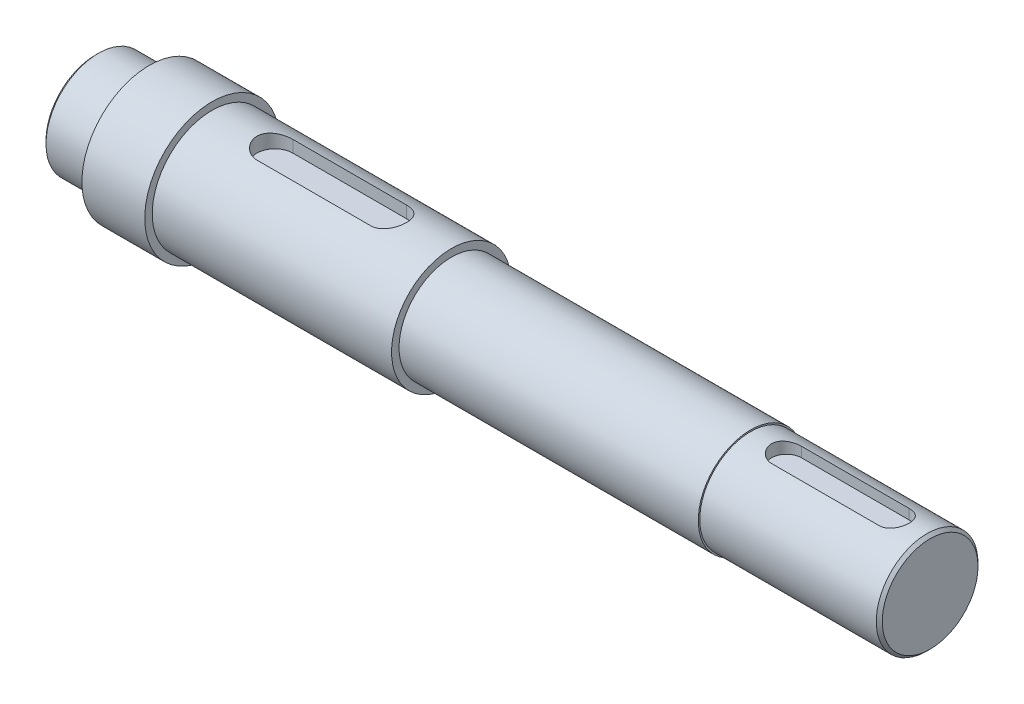
ISO-10303-21;
HEADER;
FILE_DESCRIPTION(('STEP AP214'),'2;1');
FILE_NAME('part.step','',(''),(''),'','','');
FILE_SCHEMA(('AUTOMOTIVE_DESIGN { 1 0 10303 214 1 1 1 1 }'));
ENDSEC;
DATA;
#1=APPLICATION_CONTEXT('core data for automotive mechanical design processes');
#2=APPLICATION_PROTOCOL_DEFINITION('international standard','automotive_design',2000,#1);
#3=PRODUCT_CONTEXT('',#1,'mechanical');
#4=PRODUCT('Part','Part','',(#3));
#5=PRODUCT_RELATED_PRODUCT_CATEGORY('part','',(#4));
#6=PRODUCT_DEFINITION_FORMATION('','',#4);
#7=PRODUCT_DEFINITION_CONTEXT('part definition',#1,'design');
#8=PRODUCT_DEFINITION('design','',#6,#7);
#9=PRODUCT_DEFINITION_SHAPE('','',#8);
#10=(LENGTH_UNIT() NAMED_UNIT(*) SI_UNIT(.MILLI.,.METRE.));
#11=(NAMED_UNIT(*) PLANE_ANGLE_UNIT() SI_UNIT($,.RADIAN.));
#12=(NAMED_UNIT(*) SI_UNIT($,.STERADIAN.) SOLID_ANGLE_UNIT());
#13=UNCERTAINTY_MEASURE_WITH_UNIT(LENGTH_MEASURE(1.E-05),#10,'distance_accuracy_value','');
#14=(GEOMETRIC_REPRESENTATION_CONTEXT(3) GLOBAL_UNCERTAINTY_ASSIGNED_CONTEXT((#13)) GLOBAL_UNIT_ASSIGNED_CONTEXT((#10,
#11,#12)) REPRESENTATION_CONTEXT('',''));
#15=CARTESIAN_POINT('',(0.,0.,0.));
#16=DIRECTION('',(0.,0.,1.));
#17=DIRECTION('',(1.,0.,0.));
#18=AXIS2_PLACEMENT_3D('',#15,#16,#17);
#19=CARTESIAN_POINT('',(-40.,0.,0.));
#20=DIRECTION('',(1.,0.,0.));
#21=DIRECTION('',(0.,0.,-1.));
#22=AXIS2_PLACEMENT_3D('',#19,#20,#21);
#23=CYLINDRICAL_SURFACE('',#22,20.);
#24=CARTESIAN_POINT('',(19.,19.0787840283389,5.99999999999999));
#25=CARTESIAN_POINT('',(19.1646679949108,19.0787603919218,6.00002230630953));
#26=CARTESIAN_POINT('',(19.3293273869304,19.0809150948054,5.9932221282886));
#27=CARTESIAN_POINT('',(19.6573894283846,19.089408588524,5.96614198358438));
#28=CARTESIAN_POINT('',(19.8207923520137,19.0957464386677,5.94586504749982));
#29=CARTESIAN_POINT('',(20.1447667936842,19.1124126760415,5.89206455668659));
#30=CARTESIAN_POINT('',(20.3053444279638,19.1227309292375,5.85857463708937));
#31=CARTESIAN_POINT('',(20.6229623086685,19.1470349488515,5.77865096251377));
#32=CARTESIAN_POINT('',(20.7800024624693,19.1610208111801,5.73221686903431));
#33=CARTESIAN_POINT('',(21.0893825607235,19.1922338155173,5.62682620459483));
#34=CARTESIAN_POINT('',(21.2417252187759,19.2094590438083,5.56787702452552));
#35=CARTESIAN_POINT('',(21.5408741429016,19.2466621419291,5.43788252899624));
#36=CARTESIAN_POINT('',(21.687678324328,19.2666410353108,5.36683271334056));
#37=CARTESIAN_POINT('',(21.9747849452531,19.3087849542851,5.21317247195194));
#38=CARTESIAN_POINT('',(22.1150870185297,19.3309501027959,5.13056139609832));
#39=CARTESIAN_POINT('',(22.3883877986748,19.3768680311909,4.95431913401973));
#40=CARTESIAN_POINT('',(22.5213837168722,19.4006214097184,4.8606837822377));
#41=CARTESIAN_POINT('',(22.7828635732296,19.4497584548899,4.66024014290222));
#42=CARTESIAN_POINT('',(22.9111151521982,19.4751691904069,4.55313526362689));
#43=CARTESIAN_POINT('',(23.1582539370087,19.5263015189751,4.32860344600265));
#44=CARTESIAN_POINT('',(23.2771378666711,19.5520232171847,4.21117292654717));
#45=CARTESIAN_POINT('',(23.5047413951219,19.6030710031715,3.96676059198591));
#46=CARTESIAN_POINT('',(23.6134609320288,19.6283970885393,3.83977871873937));
#47=CARTESIAN_POINT('',(23.8200192544725,19.6779706962222,3.57705696576209));
#48=CARTESIAN_POINT('',(23.917858125839,19.7022182270443,3.44131715512968));
#49=CARTESIAN_POINT('',(24.1039097682599,19.7494715734221,3.15899953964076));
#50=CARTESIAN_POINT('',(24.1918780463025,19.7724407517412,3.01225429870653));
#51=CARTESIAN_POINT('',(24.355063794055,19.8159158974823,2.71155717798051));
#52=CARTESIAN_POINT('',(24.430285978567,19.8364227748921,2.55760798995095));
#53=CARTESIAN_POINT('',(24.5674164393714,19.8744001644265,2.2434899603248));
#54=CARTESIAN_POINT('',(24.6293222547682,19.8918701152059,2.08331997555618));
#55=CARTESIAN_POINT('',(24.7392375024558,19.923254535561,1.75801430484772));
#56=CARTESIAN_POINT('',(24.7872529399682,19.9371705413066,1.59288079897388));
#57=CARTESIAN_POINT('',(24.8678255467277,19.960709769643,1.26354510595574));
#58=CARTESIAN_POINT('',(24.9007806269582,19.9704430293701,1.09944808925078));
#59=CARTESIAN_POINT('',(24.9528719972864,19.9858966495547,0.768952154148941));
#60=CARTESIAN_POINT('',(24.9720138041346,19.9916186120195,0.602554181799287));
#61=CARTESIAN_POINT('',(24.9963199648569,19.9988929276978,0.268644299740222));
#62=CARTESIAN_POINT('',(25.0014838943061,20.0004451543012,0.101132356360969));
#63=CARTESIAN_POINT('',(24.9977835949215,19.9993350985709,-0.233720900410867));
#64=CARTESIAN_POINT('',(24.9889196235372,19.9966728935831,-0.40106221687851));
#65=CARTESIAN_POINT('',(24.9577577883976,19.9873626800314,-0.728949940400316));
#66=CARTESIAN_POINT('',(24.9358999900172,19.9808452710305,-0.889542117296662));
#67=CARTESIAN_POINT('',(24.8793045182417,19.9641050678088,-1.20830021014907));
#68=CARTESIAN_POINT('',(24.8445624577749,19.9538810115069,-1.36646528055415));
#69=CARTESIAN_POINT('',(24.7625076983902,19.9300014175933,-1.67917461818939));
#70=CARTESIAN_POINT('',(24.7151992242771,19.916347033335,-1.83372008335732));
#71=CARTESIAN_POINT('',(24.6083697289368,19.885954581515,-2.13828018933735));
#72=CARTESIAN_POINT('',(24.5488441160033,19.8692153547843,-2.28829310223871));
#73=CARTESIAN_POINT('',(24.4173094204607,19.8328818557961,-2.58443507880942));
#74=CARTESIAN_POINT('',(24.3451671028017,19.8132575095082,-2.73050124822121));
#75=CARTESIAN_POINT('',(24.1893768526706,19.7717979578185,-3.01609632375421));
#76=CARTESIAN_POINT('',(24.1057249716159,19.7499619943591,-3.15562296424242));
#77=CARTESIAN_POINT('',(23.9275130175587,19.704643118031,-3.42724384686892));
#78=CARTESIAN_POINT('',(23.8329528185717,19.681160186142,-3.55933800314028));
#79=CARTESIAN_POINT('',(23.6335413215712,19.6331439703208,-3.81531376455357));
#80=CARTESIAN_POINT('',(23.5286897234991,19.6086106557752,-3.93919513006485));
#81=CARTESIAN_POINT('',(23.3051027565368,19.5581593507452,-4.18263653591652));
#82=CARTESIAN_POINT('',(23.1859873205257,19.5322244988475,-4.30184428600934));
#83=CARTESIAN_POINT('',(22.9381664964976,19.4806179410542,-4.52981041510268));
#84=CARTESIAN_POINT('',(22.8094642039191,19.454946153239,-4.63857214120816));
#85=CARTESIAN_POINT('',(22.5431596037615,19.4045581786367,-4.84504126060966));
#86=CARTESIAN_POINT('',(22.4055514280994,19.3798426394128,-4.94274124635233));
#87=CARTESIAN_POINT('',(22.1224409076672,19.3321023379674,-5.12628631686325));
#88=CARTESIAN_POINT('',(21.9769416624216,19.3090769201297,-5.21213600998878));
#89=CARTESIAN_POINT('',(21.6773648649068,19.2651525602885,-5.37223080367567));
#90=CARTESIAN_POINT('',(21.523212921341,19.2442786555291,-5.44634371437402));
#91=CARTESIAN_POINT('',(21.2088781586389,19.2055937237889,-5.58122691640504));
#92=CARTESIAN_POINT('',(21.0486978375224,19.1877814448102,-5.64200266456204));
#93=CARTESIAN_POINT('',(20.7235678816501,19.1557967477957,-5.74966145349632));
#94=CARTESIAN_POINT('',(20.5586234734372,19.1416204978023,-5.79655912825488));
#95=CARTESIAN_POINT('',(20.225106819549,19.1173543231182,-5.87609462586439));
#96=CARTESIAN_POINT('',(20.0565362849515,19.1072625137754,-5.90873902604378));
#97=CARTESIAN_POINT('',(19.7400629297635,19.0925703406668,-5.95603131732402));
#98=CARTESIAN_POINT('',(19.59245829064,19.0874107715083,-5.97251971262426));
#99=CARTESIAN_POINT('',(19.2965728875247,19.0805126306352,-5.99450261914156));
#100=CARTESIAN_POINT('',(19.1482934404253,19.0787690288453,-6.00001329545509));
#101=CARTESIAN_POINT('',(19.,19.0787840283389,-6.00000000000001));
#102=B_SPLINE_CURVE_WITH_KNOTS('',3,(#24,#25,#26,#27,#28,#29,#30,#31,#32,#33,#34,#35,#36,#37,
#38,#39,#40,#41,#42,#43,#44,#45,#46,#47,#48,#49,#50,#51,#52,#53,#54,#55,#56,#57,#58,#59,#60,#61,
#62,#63,#64,#65,#66,#67,#68,#69,#70,#71,#72,#73,#74,#75,#76,#77,#78,#79,#80,#81,#82,#83,#84,#85,
#86,#87,#88,#89,#90,#91,#92,#93,#94,#95,#96,#97,#98,#99,#100,#101),.UNSPECIFIED.,.F.,.F.,(4,2,2,
2,2,2,2,2,2,2,2,2,2,2,2,2,2,2,2,2,2,2,2,2,2,2,2,2,2,2,2,2,2,2,2,2,2,2,4),(0.,0.493836284878931,
0.987561555412166,1.48003801924602,1.97252736296405,2.4647266679518,2.95710942192587,
3.44951987503683,3.94211698773001,4.44857898474592,4.95521732942467,5.46185875834847,
5.96849619046396,6.48574341264195,7.00279888450885,7.5199498274806,8.03687685551445,
8.53921958328379,9.04136157401789,9.5435188116382,10.0456668334346,10.531706521874,
11.0179118582603,11.5039539397551,11.9901790315928,12.4818885441265,12.9737671698834,
13.4656514771114,13.9575501300996,14.4684682486943,14.9792221093922,15.4903160010787,
16.001210574562,16.5175029344931,17.0335836608614,17.549118241575,18.0644146711719,
18.509813123396,18.9545552237083),.UNSPECIFIED.);
#103=CARTESIAN_POINT('',(19.,19.0787840283389,5.99999999999999));
#104=VERTEX_POINT('',#103);
#105=CARTESIAN_POINT('',(19.,19.0787840283389,-6.00000000000001));
#106=VERTEX_POINT('',#105);
#107=EDGE_CURVE('E181',#104,#106,#102,.T.);
#108=ORIENTED_EDGE('',*,*,#107,.F.);
#109=DIRECTION('',(1.,0.,0.));
#110=VECTOR('',#109,1.);
#111=CARTESIAN_POINT('',(-40.,19.0787840283389,6.));
#112=LINE('',#111,#110);
#113=CARTESIAN_POINT('',(-19.,19.0787840283389,6.));
#114=VERTEX_POINT('',#113);
#115=EDGE_CURVE('E149',#114,#104,#112,.T.);
#116=ORIENTED_EDGE('',*,*,#115,.F.);
#117=CARTESIAN_POINT('',(-19.,19.0787840283389,-6.));
#118=CARTESIAN_POINT('',(-19.1646679949108,19.0787603919218,-6.00002230630954));
#119=CARTESIAN_POINT('',(-19.3293273869304,19.0809150948054,-5.99322212828861));
#120=CARTESIAN_POINT('',(-19.6573894283846,19.089408588524,-5.96614198358439));
#121=CARTESIAN_POINT('',(-19.8207923520137,19.0957464386677,-5.94586504749983));
#122=CARTESIAN_POINT('',(-20.1447667936842,19.1124126760415,-5.89206455668659));
#123=CARTESIAN_POINT('',(-20.3053444279638,19.1227309292375,-5.85857463708937));
#124=CARTESIAN_POINT('',(-20.6229623086685,19.1470349488515,-5.77865096251378));
#125=CARTESIAN_POINT('',(-20.7800024624693,19.1610208111801,-5.73221686903431));
#126=CARTESIAN_POINT('',(-21.0893825607235,19.1922338155173,-5.62682620459484));
#127=CARTESIAN_POINT('',(-21.2417252187759,19.2094590438083,-5.56787702452553));
#128=CARTESIAN_POINT('',(-21.5408741429016,19.2466621419291,-5.43788252899625));
#129=CARTESIAN_POINT('',(-21.687678324328,19.2666410353108,-5.36683271334057));
#130=CARTESIAN_POINT('',(-21.9747849452531,19.3087849542851,-5.21317247195195));
#131=CARTESIAN_POINT('',(-22.1150870185297,19.3309501027959,-5.13056139609833));
#132=CARTESIAN_POINT('',(-22.3883877986748,19.3768680311909,-4.95431913401973));
#133=CARTESIAN_POINT('',(-22.5213837168722,19.4006214097184,-4.86068378223771));
#134=CARTESIAN_POINT('',(-22.7828635732296,19.4497584548899,-4.66024014290223));
#135=CARTESIAN_POINT('',(-22.9111151521982,19.4751691904069,-4.55313526362689));
#136=CARTESIAN_POINT('',(-23.1582539370087,19.5263015189751,-4.32860344600266));
#137=CARTESIAN_POINT('',(-23.2771378666711,19.5520232171847,-4.21117292654718));
#138=CARTESIAN_POINT('',(-23.5047413951219,19.6030710031715,-3.96676059198591));
#139=CARTESIAN_POINT('',(-23.6134609320288,19.6283970885393,-3.83977871873938));
#140=CARTESIAN_POINT('',(-23.8200192544725,19.6779706962222,-3.5770569657621));
#141=CARTESIAN_POINT('',(-23.917858125839,19.7022182270443,-3.44131715512968));
#142=CARTESIAN_POINT('',(-24.1039097682599,19.7494715734221,-3.15899953964076));
#143=CARTESIAN_POINT('',(-24.1918780463025,19.7724407517412,-3.01225429870653));
#144=CARTESIAN_POINT('',(-24.355063794055,19.8159158974823,-2.71155717798052));
#145=CARTESIAN_POINT('',(-24.430285978567,19.8364227748921,-2.55760798995096));
#146=CARTESIAN_POINT('',(-24.5674164393714,19.8744001644265,-2.24348996032481));
#147=CARTESIAN_POINT('',(-24.6293222547682,19.8918701152059,-2.08331997555618));
#148=CARTESIAN_POINT('',(-24.7392375024558,19.923254535561,-1.75801430484772));
#149=CARTESIAN_POINT('',(-24.7872529399682,19.9371705413066,-1.59288079897389));
#150=CARTESIAN_POINT('',(-24.8678255467277,19.960709769643,-1.26354510595574));
#151=CARTESIAN_POINT('',(-24.9007806269582,19.9704430293701,-1.09944808925078));
#152=CARTESIAN_POINT('',(-24.9528719972864,19.9858966495547,-0.768952154148946));
#153=CARTESIAN_POINT('',(-24.9720138041346,19.9916186120195,-0.602554181799292));
#154=CARTESIAN_POINT('',(-24.9963199648569,19.9988929276978,-0.268644299740228));
#155=CARTESIAN_POINT('',(-25.0014838943061,20.0004451543012,-0.101132356360973));
#156=CARTESIAN_POINT('',(-24.9977835949215,19.9993350985709,0.233720900410862));
#157=CARTESIAN_POINT('',(-24.9889196235372,19.9966728935831,0.401062216878504));
#158=CARTESIAN_POINT('',(-24.9577577883976,19.9873626800314,0.72894994040031));
#159=CARTESIAN_POINT('',(-24.9358999900172,19.9808452710305,0.889542117296655));
#160=CARTESIAN_POINT('',(-24.8793045182417,19.9641050678088,1.20830021014906));
#161=CARTESIAN_POINT('',(-24.8445624577749,19.9538810115069,1.36646528055415));
#162=CARTESIAN_POINT('',(-24.7625076983902,19.9300014175933,1.67917461818938));
#163=CARTESIAN_POINT('',(-24.7151992242771,19.916347033335,1.83372008335732));
#164=CARTESIAN_POINT('',(-24.6083697289368,19.885954581515,2.13828018933734));
#165=CARTESIAN_POINT('',(-24.5488441160033,19.8692153547843,2.2882931022387));
#166=CARTESIAN_POINT('',(-24.4173094204607,19.8328818557961,2.58443507880942));
#167=CARTESIAN_POINT('',(-24.3451671028017,19.8132575095082,2.7305012482212));
#168=CARTESIAN_POINT('',(-24.1893768526706,19.7717979578185,3.0160963237542));
#169=CARTESIAN_POINT('',(-24.1057249716159,19.7499619943591,3.15562296424241));
#170=CARTESIAN_POINT('',(-23.9275130175587,19.704643118031,3.42724384686891));
#171=CARTESIAN_POINT('',(-23.8329528185717,19.681160186142,3.55933800314027));
#172=CARTESIAN_POINT('',(-23.6335413215712,19.6331439703208,3.81531376455356));
#173=CARTESIAN_POINT('',(-23.5286897234991,19.6086106557752,3.93919513006484));
#174=CARTESIAN_POINT('',(-23.3051027565368,19.5581593507452,4.18263653591652));
#175=CARTESIAN_POINT('',(-23.1859873205257,19.5322244988475,4.30184428600934));
#176=CARTESIAN_POINT('',(-22.9381664964976,19.4806179410542,4.52981041510267));
#177=CARTESIAN_POINT('',(-22.8094642039191,19.454946153239,4.63857214120816));
#178=CARTESIAN_POINT('',(-22.5431596037615,19.4045581786367,4.84504126060965));
#179=CARTESIAN_POINT('',(-22.4055514280994,19.3798426394128,4.94274124635232));
#180=CARTESIAN_POINT('',(-22.1224409076672,19.3321023379674,5.12628631686324));
#181=CARTESIAN_POINT('',(-21.9769416624216,19.3090769201297,5.21213600998877));
#182=CARTESIAN_POINT('',(-21.6773648649068,19.2651525602885,5.37223080367566));
#183=CARTESIAN_POINT('',(-21.523212921341,19.2442786555291,5.44634371437402));
#184=CARTESIAN_POINT('',(-21.2088781586389,19.2055937237889,5.58122691640503));
#185=CARTESIAN_POINT('',(-21.0486978375224,19.1877814448102,5.64200266456203));
#186=CARTESIAN_POINT('',(-20.7235678816501,19.1557967477957,5.74966145349631));
#187=CARTESIAN_POINT('',(-20.5586234734371,19.1416204978023,5.79655912825487));
#188=CARTESIAN_POINT('',(-20.225106819549,19.1173543231182,5.87609462586438));
#189=CARTESIAN_POINT('',(-20.0565362849515,19.1072625137754,5.90873902604377));
#190=CARTESIAN_POINT('',(-19.7400629297635,19.0925703406668,5.95603131732401));
#191=CARTESIAN_POINT('',(-19.59245829064,19.0874107715083,5.97251971262425));
#192=CARTESIAN_POINT('',(-19.2965728875247,19.0805126306352,5.99450261914156));
#193=CARTESIAN_POINT('',(-19.1482934404253,19.0787690288453,6.00001329545509));
#194=CARTESIAN_POINT('',(-19.,19.0787840283389,6.));
#195=B_SPLINE_CURVE_WITH_KNOTS('',3,(#117,#118,#119,#120,#121,#122,#123,#124,#125,#126,#127,
#128,#129,#130,#131,#132,#133,#134,#135,#136,#137,#138,#139,#140,#141,#142,#143,#144,#145,#146,
#147,#148,#149,#150,#151,#152,#153,#154,#155,#156,#157,#158,#159,#160,#161,#162,#163,#164,#165,
#166,#167,#168,#169,#170,#171,#172,#173,#174,#175,#176,#177,#178,#179,#180,#181,#182,#183,#184,
#185,#186,#187,#188,#189,#190,#191,#192,#193,#194),.UNSPECIFIED.,.F.,.F.,(4,2,2,2,2,2,2,2,2,2,2,
2,2,2,2,2,2,2,2,2,2,2,2,2,2,2,2,2,2,2,2,2,2,2,2,2,2,2,4),(0.,0.493836284878931,
0.987561555412166,1.48003801924602,1.97252736296405,2.4647266679518,2.95710942192587,
3.44951987503683,3.94211698773001,4.44857898474593,4.95521732942467,5.46185875834847,
5.96849619046396,6.48574341264195,7.00279888450885,7.5199498274806,8.03687685551445,
8.53921958328379,9.04136157401789,9.54351881163821,10.0456668334346,10.531706521874,
11.0179118582603,11.5039539397551,11.9901790315928,12.4818885441265,12.9737671698834,
13.4656514771114,13.9575501300996,14.4684682486943,14.9792221093922,15.4903160010787,
16.001210574562,16.517502934493,17.0335836608614,17.5491182415751,18.0644146711719,
18.509813123396,18.9545552237083),.UNSPECIFIED.);
#196=CARTESIAN_POINT('',(-19.,19.0787840283389,-6.));
#197=VERTEX_POINT('',#196);
#198=EDGE_CURVE('E212',#197,#114,#195,.T.);
#199=ORIENTED_EDGE('',*,*,#198,.F.);
#200=DIRECTION('',(1.,0.,0.));
#201=VECTOR('',#200,1.);
#202=CARTESIAN_POINT('',(-40.,19.0787840283389,-6.));
#203=LINE('',#202,#201);
#204=EDGE_CURVE('E191',#106,#197,#203,.F.);
#205=ORIENTED_EDGE('',*,*,#204,.F.);
#206=EDGE_LOOP('',(#108,#116,#199,#205));
#207=FACE_BOUND('',#206,.T.);
#208=CARTESIAN_POINT('',(-40.,0.,0.));
#209=DIRECTION('',(1.,0.,0.));
#210=DIRECTION('',(0.,0.,-1.));
#211=AXIS2_PLACEMENT_3D('',#208,#209,#210);
#212=CIRCLE('',#211,20.);
#213=CARTESIAN_POINT('',(-40.,0.,-20.));
#214=VERTEX_POINT('',#213);
#215=EDGE_CURVE('E153',#214,#214,#212,.T.);
#216=ORIENTED_EDGE('',*,*,#215,.T.);
#217=EDGE_LOOP('',(#216));
#218=FACE_BOUND('',#217,.T.);
#219=CARTESIAN_POINT('',(40.,0.,0.));
#220=DIRECTION('',(1.,0.,0.));
#221=DIRECTION('',(0.,0.,-1.));
#222=AXIS2_PLACEMENT_3D('',#219,#220,#221);
#223=CIRCLE('',#222,20.);
#224=CARTESIAN_POINT('',(40.,0.,-20.));
#225=VERTEX_POINT('',#224);
#226=EDGE_CURVE('E171',#225,#225,#223,.T.);
#227=ORIENTED_EDGE('',*,*,#226,.F.);
#228=EDGE_LOOP('',(#227));
#229=FACE_BOUND('',#228,.T.);
#230=ADVANCED_FACE('F36',(#207,#218,#229),#23,.T.);
#231=CARTESIAN_POINT('',(40.,0.,0.));
#232=DIRECTION('',(1.,0.,0.));
#233=DIRECTION('',(0.,0.,-1.));
#234=AXIS2_PLACEMENT_3D('',#231,#232,#233);
#235=PLANE('',#234);
#236=CARTESIAN_POINT('',(40.,0.,0.));
#237=DIRECTION('',(1.,0.,0.));
#238=DIRECTION('',(0.,0.,-1.));
#239=AXIS2_PLACEMENT_3D('',#236,#237,#238);
#240=CIRCLE('',#239,17.5);
#241=CARTESIAN_POINT('',(40.,0.,-17.5));
#242=VERTEX_POINT('',#241);
#243=EDGE_CURVE('E138',#242,#242,#240,.T.);
#244=ORIENTED_EDGE('',*,*,#243,.F.);
#245=EDGE_LOOP('',(#244));
#246=FACE_BOUND('',#245,.T.);
#247=ORIENTED_EDGE('',*,*,#226,.T.);
#248=EDGE_LOOP('',(#247));
#249=FACE_BOUND('',#248,.T.);
#250=ADVANCED_FACE('F210',(#246,#249),#235,.T.);
#251=CARTESIAN_POINT('',(-19.,15.1,0.));
#252=DIRECTION('',(0.,1.,0.));
#253=DIRECTION('',(0.,0.,1.));
#254=AXIS2_PLACEMENT_3D('',#251,#252,#253);
#255=CYLINDRICAL_SURFACE('',#254,6.);
#256=DIRECTION('',(0.,1.,0.));
#257=VECTOR('',#256,1.);
#258=CARTESIAN_POINT('',(-19.,15.1,-6.));
#259=LINE('',#258,#257);
#260=CARTESIAN_POINT('',(-19.,15.1,-6.));
#261=VERTEX_POINT('',#260);
#262=EDGE_CURVE('E168',#261,#197,#259,.T.);
#263=ORIENTED_EDGE('',*,*,#262,.T.);
#264=ORIENTED_EDGE('',*,*,#198,.T.);
#265=DIRECTION('',(0.,1.,0.));
#266=VECTOR('',#265,1.);
#267=CARTESIAN_POINT('',(-19.,15.1,6.));
#268=LINE('',#267,#266);
#269=CARTESIAN_POINT('',(-19.,15.1,6.));
#270=VERTEX_POINT('',#269);
#271=EDGE_CURVE('E59',#270,#114,#268,.T.);
#272=ORIENTED_EDGE('',*,*,#271,.F.);
#273=CARTESIAN_POINT('',(-19.,15.1,0.));
#274=DIRECTION('',(0.,1.,0.));
#275=DIRECTION('',(0.,0.,1.));
#276=AXIS2_PLACEMENT_3D('',#273,#274,#275);
#277=CIRCLE('',#276,6.);
#278=EDGE_CURVE('E156',#261,#270,#277,.T.);
#279=ORIENTED_EDGE('',*,*,#278,.F.);
#280=EDGE_LOOP('',(#263,#264,#272,#279));
#281=FACE_BOUND('',#280,.T.);
#282=ADVANCED_FACE('F207',(#281),#255,.F.);
#283=CARTESIAN_POINT('',(-19.,15.1,-6.));
#284=DIRECTION('',(0.,0.,-1.));
#285=DIRECTION('',(-1.,0.,0.));
#286=AXIS2_PLACEMENT_3D('',#283,#284,#285);
#287=PLANE('',#286);
#288=ORIENTED_EDGE('',*,*,#204,.T.);
#289=ORIENTED_EDGE('',*,*,#262,.F.);
#290=DIRECTION('',(-1.,0.,0.));
#291=VECTOR('',#290,1.);
#292=CARTESIAN_POINT('',(-19.,15.1,-6.));
#293=LINE('',#292,#291);
#294=CARTESIAN_POINT('',(19.,15.1,-6.00000000000001));
#295=VERTEX_POINT('',#294);
#296=EDGE_CURVE('E165',#295,#261,#293,.T.);
#297=ORIENTED_EDGE('',*,*,#296,.F.);
#298=DIRECTION('',(0.,1.,0.));
#299=VECTOR('',#298,1.);
#300=CARTESIAN_POINT('',(19.,15.1,-6.00000000000001));
#301=LINE('',#300,#299);
#302=EDGE_CURVE('E172',#295,#106,#301,.T.);
#303=ORIENTED_EDGE('',*,*,#302,.T.);
#304=EDGE_LOOP('',(#288,#289,#297,#303));
#305=FACE_BOUND('',#304,.T.);
#306=ADVANCED_FACE('F201',(#305),#287,.F.);
#307=CARTESIAN_POINT('',(19.,15.1,0.));
#308=DIRECTION('',(0.,1.,0.));
#309=DIRECTION('',(0.,0.,1.));
#310=AXIS2_PLACEMENT_3D('',#307,#308,#309);
#311=CYLINDRICAL_SURFACE('',#310,6.);
#312=DIRECTION('',(0.,1.,0.));
#313=VECTOR('',#312,1.);
#314=CARTESIAN_POINT('',(19.,15.1,5.99999999999999));
#315=LINE('',#314,#313);
#316=CARTESIAN_POINT('',(19.,15.1,5.99999999999999));
#317=VERTEX_POINT('',#316);
#318=EDGE_CURVE('E175',#317,#104,#315,.T.);
#319=ORIENTED_EDGE('',*,*,#318,.T.);
#320=ORIENTED_EDGE('',*,*,#107,.T.);
#321=ORIENTED_EDGE('',*,*,#302,.F.);
#322=CARTESIAN_POINT('',(19.,15.1,0.));
#323=DIRECTION('',(0.,1.,0.));
#324=DIRECTION('',(0.,0.,1.));
#325=AXIS2_PLACEMENT_3D('',#322,#323,#324);
#326=CIRCLE('',#325,6.);
#327=EDGE_CURVE('E162',#317,#295,#326,.T.);
#328=ORIENTED_EDGE('',*,*,#327,.F.);
#329=EDGE_LOOP('',(#319,#320,#321,#328));
#330=FACE_BOUND('',#329,.T.);
#331=ADVANCED_FACE('F195',(#330),#311,.F.);
#332=CARTESIAN_POINT('',(-19.,15.1,6.));
#333=DIRECTION('',(0.,0.,1.));
#334=DIRECTION('',(1.,0.,0.));
#335=AXIS2_PLACEMENT_3D('',#332,#333,#334);
#336=PLANE('',#335);
#337=ORIENTED_EDGE('',*,*,#115,.T.);
#338=ORIENTED_EDGE('',*,*,#318,.F.);
#339=DIRECTION('',(1.,0.,0.));
#340=VECTOR('',#339,1.);
#341=CARTESIAN_POINT('',(-19.,15.1,6.));
#342=LINE('',#341,#340);
#343=EDGE_CURVE('E159',#270,#317,#342,.T.);
#344=ORIENTED_EDGE('',*,*,#343,.F.);
#345=ORIENTED_EDGE('',*,*,#271,.T.);
#346=EDGE_LOOP('',(#337,#338,#344,#345));
#347=FACE_BOUND('',#346,.T.);
#348=ADVANCED_FACE('F200',(#347),#336,.F.);
#349=CARTESIAN_POINT('',(-19.,15.1,0.));
#350=DIRECTION('',(0.,1.,0.));
#351=DIRECTION('',(0.,0.,1.));
#352=AXIS2_PLACEMENT_3D('',#349,#350,#351);
#353=PLANE('',#352);
#354=ORIENTED_EDGE('',*,*,#278,.T.);
#355=ORIENTED_EDGE('',*,*,#343,.T.);
#356=ORIENTED_EDGE('',*,*,#327,.T.);
#357=ORIENTED_EDGE('',*,*,#296,.T.);
#358=EDGE_LOOP('',(#354,#355,#356,#357));
#359=FACE_BOUND('',#358,.T.);
#360=ADVANCED_FACE('F206',(#359),#353,.T.);
#361=CARTESIAN_POINT('',(-61.,0.,0.));
#362=DIRECTION('',(1.,0.,0.));
#363=DIRECTION('',(0.,0.,-1.));
#364=AXIS2_PLACEMENT_3D('',#361,#362,#363);
#365=CYLINDRICAL_SURFACE('',#364,22.5);
#366=CARTESIAN_POINT('',(-61.,0.,0.));
#367=DIRECTION('',(-1.,0.,0.));
#368=DIRECTION('',(0.,0.,1.));
#369=AXIS2_PLACEMENT_3D('',#366,#367,#368);
#370=CIRCLE('',#369,22.5);
#371=CARTESIAN_POINT('',(-61.,0.,-22.5));
#372=VERTEX_POINT('',#371);
#373=EDGE_CURVE('E150',#372,#372,#370,.T.);
#374=CARTESIAN_POINT('',(-40.,0.,0.));
#375=DIRECTION('',(-1.,0.,0.));
#376=DIRECTION('',(0.,0.,1.));
#377=AXIS2_PLACEMENT_3D('',#374,#375,#376);
#378=CIRCLE('',#377,22.5);
#379=CARTESIAN_POINT('',(-40.,0.,-22.5));
#380=VERTEX_POINT('',#379);
#381=EDGE_CURVE('E141',#380,#380,#378,.T.);
#382=CARTESIAN_POINT('',(-61.,0.,-22.5));
#383=CARTESIAN_POINT('',(-60.78125,0.,-22.5));
#384=CARTESIAN_POINT('',(-60.5625,0.,-22.5));
#385=CARTESIAN_POINT('',(-60.125,0.,-22.5));
#386=CARTESIAN_POINT('',(-59.90625,0.,-22.5));
#387=CARTESIAN_POINT('',(-59.46875,0.,-22.5));
#388=CARTESIAN_POINT('',(-59.25,0.,-22.5));
#389=CARTESIAN_POINT('',(-58.8125,0.,-22.5));
#390=CARTESIAN_POINT('',(-58.59375,0.,-22.5));
#391=CARTESIAN_POINT('',(-58.15625,0.,-22.5));
#392=CARTESIAN_POINT('',(-57.9375,0.,-22.5));
#393=CARTESIAN_POINT('',(-57.5,0.,-22.5));
#394=CARTESIAN_POINT('',(-57.28125,0.,-22.5));
#395=CARTESIAN_POINT('',(-56.84375,0.,-22.5));
#396=CARTESIAN_POINT('',(-56.625,0.,-22.5));
#397=CARTESIAN_POINT('',(-56.1875,0.,-22.5));
#398=CARTESIAN_POINT('',(-55.96875,0.,-22.5));
#399=CARTESIAN_POINT('',(-55.53125,0.,-22.5));
#400=CARTESIAN_POINT('',(-55.3125,0.,-22.5));
#401=CARTESIAN_POINT('',(-54.875,0.,-22.5));
#402=CARTESIAN_POINT('',(-54.65625,0.,-22.5));
#403=CARTESIAN_POINT('',(-54.21875,0.,-22.5));
#404=CARTESIAN_POINT('',(-54.,0.,-22.5));
#405=CARTESIAN_POINT('',(-53.5625,0.,-22.5));
#406=CARTESIAN_POINT('',(-53.34375,0.,-22.5));
#407=CARTESIAN_POINT('',(-52.90625,0.,-22.5));
#408=CARTESIAN_POINT('',(-52.6875,0.,-22.5));
#409=CARTESIAN_POINT('',(-52.25,0.,-22.5));
#410=CARTESIAN_POINT('',(-52.03125,0.,-22.5));
#411=CARTESIAN_POINT('',(-51.59375,0.,-22.5));
#412=CARTESIAN_POINT('',(-51.375,0.,-22.5));
#413=CARTESIAN_POINT('',(-50.9375,0.,-22.5));
#414=CARTESIAN_POINT('',(-50.71875,0.,-22.5));
#415=CARTESIAN_POINT('',(-50.28125,0.,-22.5));
#416=CARTESIAN_POINT('',(-50.0625,0.,-22.5));
#417=CARTESIAN_POINT('',(-49.625,0.,-22.5));
#418=CARTESIAN_POINT('',(-49.40625,0.,-22.5));
#419=CARTESIAN_POINT('',(-48.96875,0.,-22.5));
#420=CARTESIAN_POINT('',(-48.75,0.,-22.5));
#421=CARTESIAN_POINT('',(-48.3125,0.,-22.5));
#422=CARTESIAN_POINT('',(-48.09375,0.,-22.5));
#423=CARTESIAN_POINT('',(-47.65625,0.,-22.5));
#424=CARTESIAN_POINT('',(-47.4375,0.,-22.5));
#425=CARTESIAN_POINT('',(-47.,0.,-22.5));
#426=CARTESIAN_POINT('',(-46.78125,0.,-22.5));
#427=CARTESIAN_POINT('',(-46.34375,0.,-22.5));
#428=CARTESIAN_POINT('',(-46.125,0.,-22.5));
#429=CARTESIAN_POINT('',(-45.6875,0.,-22.5));
#430=CARTESIAN_POINT('',(-45.46875,0.,-22.5));
#431=CARTESIAN_POINT('',(-45.03125,0.,-22.5));
#432=CARTESIAN_POINT('',(-44.8125,0.,-22.5));
#433=CARTESIAN_POINT('',(-44.375,0.,-22.5));
#434=CARTESIAN_POINT('',(-44.15625,0.,-22.5));
#435=CARTESIAN_POINT('',(-43.71875,0.,-22.5));
#436=CARTESIAN_POINT('',(-43.5,0.,-22.5));
#437=CARTESIAN_POINT('',(-43.0625,0.,-22.5));
#438=CARTESIAN_POINT('',(-42.84375,0.,-22.5));
#439=CARTESIAN_POINT('',(-42.40625,0.,-22.5));
#440=CARTESIAN_POINT('',(-42.1875,0.,-22.5));
#441=CARTESIAN_POINT('',(-41.75,0.,-22.5));
#442=CARTESIAN_POINT('',(-41.53125,0.,-22.5));
#443=CARTESIAN_POINT('',(-41.09375,0.,-22.5));
#444=CARTESIAN_POINT('',(-40.875,0.,-22.5));
#445=CARTESIAN_POINT('',(-40.4375,0.,-22.5));
#446=CARTESIAN_POINT('',(-40.21875,0.,-22.5));
#447=CARTESIAN_POINT('',(-40.,0.,-22.5));
#448=B_SPLINE_CURVE_WITH_KNOTS('',3,(#382,#383,#384,#385,#386,#387,#388,#389,#390,#391,#392,
#393,#394,#395,#396,#397,#398,#399,#400,#401,#402,#403,#404,#405,#406,#407,#408,#409,#410,#411,
#412,#413,#414,#415,#416,#417,#418,#419,#420,#421,#422,#423,#424,#425,#426,#427,#428,#429,#430,
#431,#432,#433,#434,#435,#436,#437,#438,#439,#440,#441,#442,#443,#444,#445,#446,#447),
.UNSPECIFIED.,.F.,.F.,(4,2,2,2,2,2,2,2,2,2,2,2,2,2,2,2,2,2,2,2,2,2,2,2,2,2,2,2,2,2,2,2,4),(0.,
0.656249999999997,1.31249999999999,1.96875,2.625,3.28125,3.9375,4.59374999999999,5.25,
5.90624999999999,6.5625,7.21875,7.87499999999999,8.53125,9.18749999999999,9.84374999999999,10.5,
11.15625,11.8125,12.46875,13.125,13.78125,14.4375,15.09375,15.75,16.40625,17.0625,17.71875,
18.375,19.03125,19.6875,20.34375,21.),.UNSPECIFIED.);
#449=EDGE_CURVE('BSEAM283',#372,#380,#448,.T.);
#450=ORIENTED_EDGE('',*,*,#373,.F.);
#451=ORIENTED_EDGE('',*,*,#381,.T.);
#452=ORIENTED_EDGE('',*,*,#449,.T.);
#453=ORIENTED_EDGE('',*,*,#449,.F.);
#454=EDGE_LOOP('',(#450,#452,#451,#453));
#455=FACE_BOUND('',#454,.T.);
#456=ADVANCED_FACE('F283',(#455),#365,.T.);
#457=CARTESIAN_POINT('',(-61.,0.,0.));
#458=DIRECTION('',(-1.,0.,0.));
#459=DIRECTION('',(0.,0.,1.));
#460=AXIS2_PLACEMENT_3D('',#457,#458,#459);
#461=PLANE('',#460);
#462=CARTESIAN_POINT('',(-61.,0.,0.));
#463=DIRECTION('',(-1.,0.,0.));
#464=DIRECTION('',(0.,0.,1.));
#465=AXIS2_PLACEMENT_3D('',#462,#463,#464);
#466=CIRCLE('',#465,17.5);
#467=CARTESIAN_POINT('',(-61.,0.,17.5));
#468=VERTEX_POINT('',#467);
#469=EDGE_CURVE('E145',#468,#468,#466,.T.);
#470=ORIENTED_EDGE('',*,*,#469,.F.);
#471=EDGE_LOOP('',(#470));
#472=FACE_BOUND('',#471,.T.);
#473=ORIENTED_EDGE('',*,*,#373,.T.);
#474=EDGE_LOOP('',(#473));
#475=FACE_BOUND('',#474,.T.);
#476=ADVANCED_FACE('F279',(#472,#475),#461,.T.);
#477=CARTESIAN_POINT('',(-40.,0.,0.));
#478=DIRECTION('',(-1.,0.,0.));
#479=DIRECTION('',(0.,0.,1.));
#480=AXIS2_PLACEMENT_3D('',#477,#478,#479);
#481=PLANE('',#480);
#482=ORIENTED_EDGE('',*,*,#215,.F.);
#483=EDGE_LOOP('',(#482));
#484=FACE_BOUND('',#483,.T.);
#485=ORIENTED_EDGE('',*,*,#381,.F.);
#486=EDGE_LOOP('',(#485));
#487=FACE_BOUND('',#486,.T.);
#488=ADVANCED_FACE('F275',(#484,#487),#481,.F.);
#489=CARTESIAN_POINT('',(-79.,0.,0.));
#490=DIRECTION('',(1.,0.,0.));
#491=DIRECTION('',(0.,0.,-1.));
#492=AXIS2_PLACEMENT_3D('',#489,#490,#491);
#493=CYLINDRICAL_SURFACE('',#492,17.5);
#494=CARTESIAN_POINT('',(-78.,0.,0.));
#495=DIRECTION('',(-1.,0.,0.));
#496=DIRECTION('',(0.,0.,1.));
#497=AXIS2_PLACEMENT_3D('',#494,#495,#496);
#498=CIRCLE('',#497,17.5);
#499=CARTESIAN_POINT('',(-78.,0.,17.5));
#500=VERTEX_POINT('',#499);
#501=EDGE_CURVE('E144',#500,#500,#498,.F.);
#502=ORIENTED_EDGE('',*,*,#501,.T.);
#503=EDGE_LOOP('',(#502));
#504=FACE_BOUND('',#503,.T.);
#505=ORIENTED_EDGE('',*,*,#469,.T.);
#506=EDGE_LOOP('',(#505));
#507=FACE_BOUND('',#506,.T.);
#508=ADVANCED_FACE('F278',(#504,#507),#493,.T.);
#509=CARTESIAN_POINT('',(-79.,0.,0.));
#510=DIRECTION('',(-1.,0.,0.));
#511=DIRECTION('',(0.,0.,1.));
#512=AXIS2_PLACEMENT_3D('',#509,#510,#511);
#513=PLANE('',#512);
#514=CARTESIAN_POINT('',(-79.,0.,0.));
#515=DIRECTION('',(-1.,0.,0.));
#516=DIRECTION('',(0.,0.,1.));
#517=AXIS2_PLACEMENT_3D('',#514,#515,#516);
#518=CIRCLE('',#517,16.5);
#519=CARTESIAN_POINT('',(-79.,0.,16.5));
#520=VERTEX_POINT('',#519);
#521=EDGE_CURVE('E148',#520,#520,#518,.T.);
#522=ORIENTED_EDGE('',*,*,#521,.T.);
#523=EDGE_LOOP('',(#522));
#524=FACE_BOUND('',#523,.T.);
#525=ADVANCED_FACE('F298',(#524),#513,.T.);
#526=CARTESIAN_POINT('',(-79.,0.,0.));
#527=DIRECTION('',(1.,0.,0.));
#528=DIRECTION('',(0.,0.,-1.));
#529=AXIS2_PLACEMENT_3D('',#526,#527,#528);
#530=CONICAL_SURFACE('',#529,16.5,0.785398163397443);
#531=ORIENTED_EDGE('',*,*,#501,.F.);
#532=EDGE_LOOP('',(#531));
#533=FACE_BOUND('',#532,.T.);
#534=ORIENTED_EDGE('',*,*,#521,.F.);
#535=EDGE_LOOP('',(#534));
#536=FACE_BOUND('',#535,.T.);
#537=ADVANCED_FACE('F302',(#533,#536),#530,.T.);
#538=CARTESIAN_POINT('',(140.,0.,0.));
#539=DIRECTION('',(-1.,0.,0.));
#540=DIRECTION('',(0.,0.,1.));
#541=AXIS2_PLACEMENT_3D('',#538,#539,#540);
#542=CYLINDRICAL_SURFACE('',#541,17.5);
#543=CARTESIAN_POINT('',(140.,0.,0.));
#544=DIRECTION('',(1.,0.,0.));
#545=DIRECTION('',(0.,0.,-1.));
#546=AXIS2_PLACEMENT_3D('',#543,#544,#545);
#547=CIRCLE('',#546,17.5);
#548=CARTESIAN_POINT('',(140.,0.,-17.5));
#549=VERTEX_POINT('',#548);
#550=EDGE_CURVE('E129',#549,#549,#547,.T.);
#551=ORIENTED_EDGE('',*,*,#550,.F.);
#552=EDGE_LOOP('',(#551));
#553=FACE_BOUND('',#552,.T.);
#554=ORIENTED_EDGE('',*,*,#243,.T.);
#555=EDGE_LOOP('',(#554));
#556=FACE_BOUND('',#555,.T.);
#557=ADVANCED_FACE('F304',(#553,#556),#542,.T.);
#558=CARTESIAN_POINT('',(140.,0.,0.));
#559=DIRECTION('',(1.,0.,0.));
#560=DIRECTION('',(0.,0.,-1.));
#561=AXIS2_PLACEMENT_3D('',#558,#559,#560);
#562=PLANE('',#561);
#563=CARTESIAN_POINT('',(140.,0.,0.));
#564=DIRECTION('',(1.,0.,0.));
#565=DIRECTION('',(0.,0.,-1.));
#566=AXIS2_PLACEMENT_3D('',#563,#564,#565);
#567=CIRCLE('',#566,17.);
#568=CARTESIAN_POINT('',(140.,0.,-17.));
#569=VERTEX_POINT('',#568);
#570=EDGE_CURVE('E134',#569,#569,#567,.T.);
#571=ORIENTED_EDGE('',*,*,#570,.F.);
#572=EDGE_LOOP('',(#571));
#573=FACE_BOUND('',#572,.T.);
#574=ORIENTED_EDGE('',*,*,#550,.T.);
#575=EDGE_LOOP('',(#574));
#576=FACE_BOUND('',#575,.T.);
#577=ADVANCED_FACE('F258',(#573,#576),#562,.T.);
#578=CARTESIAN_POINT('',(200.,0.,0.));
#579=DIRECTION('',(-1.,0.,0.));
#580=DIRECTION('',(0.,0.,1.));
#581=AXIS2_PLACEMENT_3D('',#578,#579,#580);
#582=CYLINDRICAL_SURFACE('',#581,17.);
#583=CARTESIAN_POINT('',(199.,0.,0.));
#584=DIRECTION('',(1.,0.,0.));
#585=DIRECTION('',(0.,0.,-1.));
#586=AXIS2_PLACEMENT_3D('',#583,#584,#585);
#587=CIRCLE('',#586,17.);
#588=CARTESIAN_POINT('',(199.,0.,-17.));
#589=VERTEX_POINT('',#588);
#590=EDGE_CURVE('E11',#589,#589,#587,.F.);
#591=ORIENTED_EDGE('',*,*,#590,.T.);
#592=EDGE_LOOP('',(#591));
#593=FACE_BOUND('',#592,.T.);
#594=DIRECTION('',(-1.,0.,0.));
#595=VECTOR('',#594,1.);
#596=CARTESIAN_POINT('',(200.,16.2480768092719,-5.00000000000001));
#597=LINE('',#596,#595);
#598=CARTESIAN_POINT('',(152.,16.2480768092719,-5.));
#599=VERTEX_POINT('',#598);
#600=CARTESIAN_POINT('',(188.,16.2480768092719,-5.));
#601=VERTEX_POINT('',#600);
#602=EDGE_CURVE('E374',#599,#601,#597,.F.);
#603=ORIENTED_EDGE('',*,*,#602,.T.);
#604=CARTESIAN_POINT('',(188.,16.2480768092719,-5.));
#605=CARTESIAN_POINT('',(188.137357355192,16.2480576057113,-5.000018333656));
#606=CARTESIAN_POINT('',(188.274707513778,16.2498179552306,-4.9943406775017));
#607=CARTESIAN_POINT('',(188.54836228433,16.2567574396778,-4.97172956757709));
#608=CARTESIAN_POINT('',(188.684667117185,16.2619358310066,-4.95479856198091));
#609=CARTESIAN_POINT('',(188.954927984574,16.2755544258761,-4.90987213455411));
#610=CARTESIAN_POINT('',(189.08888897085,16.2839865768408,-4.88190402408558));
#611=CARTESIAN_POINT('',(189.35386058697,16.303848966742,-4.81515607667777));
#612=CARTESIAN_POINT('',(189.484871144332,16.3152792792465,-4.77637597443614));
#613=CARTESIAN_POINT('',(189.742983880826,16.3407928675336,-4.68834546623765));
#614=CARTESIAN_POINT('',(189.870088183277,16.35487467128,-4.63910086794502));
#615=CARTESIAN_POINT('',(190.119649711117,16.3852842844182,-4.53052243699426));
#616=CARTESIAN_POINT('',(190.242105187377,16.4016129287079,-4.47118485196365));
#617=CARTESIAN_POINT('',(190.601317784267,16.4532935993227,-4.27864731243668));
#618=CARTESIAN_POINT('',(190.83007825559,16.4913567660558,-4.13086866840749));
#619=CARTESIAN_POINT('',(191.266097692537,16.571663624385,-3.79609162419461));
#620=CARTESIAN_POINT('',(191.47259690542,16.6139932162939,-3.60813058506554));
#621=CARTESIAN_POINT('',(191.851688465487,16.6973435357355,-3.20030857492812));
#622=CARTESIAN_POINT('',(192.024275129355,16.738364042919,-2.98044226771475));
#623=CARTESIAN_POINT('',(192.333863490873,16.8154504865609,-2.50968968461803));
#624=CARTESIAN_POINT('',(192.470092761887,16.8514022123902,-2.25827531326125));
#625=CARTESIAN_POINT('',(192.698042938767,16.9132940292114,-1.73487980523034));
#626=CARTESIAN_POINT('',(192.789774972999,16.9392366230664,-1.46290383051913));
#627=CARTESIAN_POINT('',(192.923625503426,16.9775755314304,-0.914050811145549));
#628=CARTESIAN_POINT('',(192.967041360291,16.9903253914832,-0.637515280561372));
#629=CARTESIAN_POINT('',(193.007126105482,17.002085771092,-0.0808045490203091));
#630=CARTESIAN_POINT('',(193.003803466169,17.0010987807491,0.199369983089684));
#631=CARTESIAN_POINT('',(192.951384732066,16.9857482177916,0.746303613122891));
#632=CARTESIAN_POINT('',(192.90369372166,16.971795274301,1.01321077293712));
#633=CARTESIAN_POINT('',(192.766174159871,16.9325753120472,1.53505435338394));
#634=CARTESIAN_POINT('',(192.67634343216,16.9073077089352,1.78999015500088));
#635=CARTESIAN_POINT('',(192.456153655686,16.8477289854582,2.28401372569563));
#636=CARTESIAN_POINT('',(192.325345394382,16.8133183027333,2.52288833489008));
#637=CARTESIAN_POINT('',(192.027139211117,16.7390884536049,2.97583887126395));
#638=CARTESIAN_POINT('',(191.85973340786,16.6992681229319,3.18990944166786));
#639=CARTESIAN_POINT('',(191.581235803013,16.6378075752149,3.49206591688179));
#640=CARTESIAN_POINT('',(191.481783156455,16.6166346371931,3.59122666935947));
#641=CARTESIAN_POINT('',(191.274878383446,16.574515917753,3.78085070777114));
#642=CARTESIAN_POINT('',(191.167429023292,16.5535700606271,3.8713169767948));
#643=CARTESIAN_POINT('',(190.945133981091,16.5124763694782,4.04301012905333));
#644=CARTESIAN_POINT('',(190.830283366241,16.4923290824383,4.12423074837305));
#645=CARTESIAN_POINT('',(190.594023123816,16.4534309011257,4.27677509066323));
#646=CARTESIAN_POINT('',(190.472616076966,16.4346794642359,4.34810266882158));
#647=CARTESIAN_POINT('',(190.222763974027,16.3989403852824,4.48102005705394));
#648=CARTESIAN_POINT('',(190.094261250879,16.3819719919192,4.54250673717771));
#649=CARTESIAN_POINT('',(189.832266937484,16.3505443123856,4.65436101170345));
#650=CARTESIAN_POINT('',(189.698777407723,16.3360840035426,4.70473314035981));
#651=CARTESIAN_POINT('',(189.427861366181,16.3101389019193,4.79390518315267));
#652=CARTESIAN_POINT('',(189.290439153234,16.2986509883397,4.83271724105077));
#653=CARTESIAN_POINT('',(189.012607442644,16.2790104320994,4.89846852342728));
#654=CARTESIAN_POINT('',(188.872199356913,16.2708562483745,4.92541323420238));
#655=CARTESIAN_POINT('',(188.609879462443,16.2590705066644,4.96417068240109));
#656=CARTESIAN_POINT('',(188.488226619312,16.2549556983354,4.9776073516316));
#657=CARTESIAN_POINT('',(188.244385662204,16.2494550949357,4.9955205026331));
#658=CARTESIAN_POINT('',(188.122198622807,16.2480652217765,5.00001037418402));
#659=CARTESIAN_POINT('',(188.,16.2480768092719,5.));
#660=B_SPLINE_CURVE_WITH_KNOTS('',3,(#604,#605,#606,#607,#608,#609,#610,#611,#612,#613,#614,
#615,#616,#617,#618,#619,#620,#621,#622,#623,#624,#625,#626,#627,#628,#629,#630,#631,#632,#633,
#634,#635,#636,#637,#638,#639,#640,#641,#642,#643,#644,#645,#646,#647,#648,#649,#650,#651,#652,
#653,#654,#655,#656,#657,#658,#659),.UNSPECIFIED.,.F.,.F.,(4,2,2,2,2,2,2,2,2,2,2,2,2,2,2,2,2,2,
2,2,2,2,2,2,2,2,2,4),(0.,0.41193230860735,0.823775030369113,1.23460497227757,1.6454449959308,
2.05605760124986,2.46682319920939,3.28785949768652,4.131364861598,4.97501146602547,
5.83536592123969,6.69550509831942,7.53194488257934,8.36823304602236,9.17890704625409,
9.98962291880722,10.8095570219776,11.6296678725158,12.0553444367381,12.4808744253904,
12.9066910154504,13.3323412013585,13.762195215061,14.1918735414273,14.6210988891538,
15.0501255963827,15.4171594657276,15.7836436182818),.UNSPECIFIED.);
#661=CARTESIAN_POINT('',(188.,16.2480768092719,5.));
#662=VERTEX_POINT('',#661);
#663=EDGE_CURVE('E137',#601,#662,#660,.T.);
#664=ORIENTED_EDGE('',*,*,#663,.T.);
#665=DIRECTION('',(-1.,0.,0.));
#666=VECTOR('',#665,1.);
#667=CARTESIAN_POINT('',(200.,16.2480768092719,4.99999999999999));
#668=LINE('',#667,#666);
#669=CARTESIAN_POINT('',(152.,16.2480768092719,4.99999999999999));
#670=VERTEX_POINT('',#669);
#671=EDGE_CURVE('E376',#662,#670,#668,.T.);
#672=ORIENTED_EDGE('',*,*,#671,.T.);
#673=CARTESIAN_POINT('',(152.,16.2480768092719,5.));
#674=CARTESIAN_POINT('',(151.862642644808,16.2480576057113,5.000018333656));
#675=CARTESIAN_POINT('',(151.725292486222,16.2498179552306,4.9943406775017));
#676=CARTESIAN_POINT('',(151.45163771567,16.2567574396778,4.97172956757709));
#677=CARTESIAN_POINT('',(151.315332882815,16.2619358310066,4.95479856198091));
#678=CARTESIAN_POINT('',(151.045072015426,16.2755544258761,4.9098721345541));
#679=CARTESIAN_POINT('',(150.91111102915,16.2839865768408,4.88190402408558));
#680=CARTESIAN_POINT('',(150.64613941303,16.303848966742,4.81515607667777));
#681=CARTESIAN_POINT('',(150.515128855668,16.3152792792465,4.77637597443613));
#682=CARTESIAN_POINT('',(150.257016119174,16.3407928675336,4.68834546623764));
#683=CARTESIAN_POINT('',(150.129911816723,16.35487467128,4.63910086794501));
#684=CARTESIAN_POINT('',(149.880350288883,16.3852842844182,4.53052243699426));
#685=CARTESIAN_POINT('',(149.757894812623,16.4016129287079,4.47118485196364));
#686=CARTESIAN_POINT('',(149.398682215733,16.4532935993227,4.27864731243667));
#687=CARTESIAN_POINT('',(149.16992174441,16.4913567660558,4.13086866840748));
#688=CARTESIAN_POINT('',(148.733902307463,16.571663624385,3.79609162419461));
#689=CARTESIAN_POINT('',(148.52740309458,16.6139932162939,3.60813058506553));
#690=CARTESIAN_POINT('',(148.148311534513,16.6973435357355,3.20030857492811));
#691=CARTESIAN_POINT('',(147.975724870645,16.738364042919,2.98044226771474));
#692=CARTESIAN_POINT('',(147.666136509127,16.8154504865609,2.50968968461803));
#693=CARTESIAN_POINT('',(147.529907238113,16.8514022123902,2.25827531326125));
#694=CARTESIAN_POINT('',(147.301957061233,16.9132940292114,1.73487980523034));
#695=CARTESIAN_POINT('',(147.210225027001,16.9392366230664,1.46290383051913));
#696=CARTESIAN_POINT('',(147.076374496574,16.9775755314304,0.914050811145545));
#697=CARTESIAN_POINT('',(147.032958639709,16.9903253914832,0.637515280561368));
#698=CARTESIAN_POINT('',(146.992873894518,17.002085771092,0.0808045490203047));
#699=CARTESIAN_POINT('',(146.996196533831,17.0010987807491,-0.199369983089688));
#700=CARTESIAN_POINT('',(147.048615267934,16.9857482177916,-0.746303613122893));
#701=CARTESIAN_POINT('',(147.09630627834,16.971795274301,-1.01321077293712));
#702=CARTESIAN_POINT('',(147.233825840129,16.9325753120472,-1.53505435338394));
#703=CARTESIAN_POINT('',(147.32365656784,16.9073077089352,-1.78999015500089));
#704=CARTESIAN_POINT('',(147.543846344314,16.8477289854582,-2.28401372569564));
#705=CARTESIAN_POINT('',(147.674654605618,16.8133183027333,-2.52288833489008));
#706=CARTESIAN_POINT('',(147.972860788883,16.7390884536049,-2.97583887126396));
#707=CARTESIAN_POINT('',(148.14026659214,16.6992681229319,-3.18990944166786));
#708=CARTESIAN_POINT('',(148.418764196987,16.6378075752149,-3.49206591688179));
#709=CARTESIAN_POINT('',(148.518216843545,16.6166346371931,-3.59122666935947));
#710=CARTESIAN_POINT('',(148.725121616554,16.574515917753,-3.78085070777115));
#711=CARTESIAN_POINT('',(148.832570976708,16.5535700606271,-3.87131697679481));
#712=CARTESIAN_POINT('',(149.054866018909,16.5124763694782,-4.04301012905334));
#713=CARTESIAN_POINT('',(149.169716633759,16.4923290824383,-4.12423074837306));
#714=CARTESIAN_POINT('',(149.405976876184,16.4534309011257,-4.27677509066324));
#715=CARTESIAN_POINT('',(149.527383923034,16.4346794642359,-4.34810266882159));
#716=CARTESIAN_POINT('',(149.777236025973,16.3989403852824,-4.48102005705394));
#717=CARTESIAN_POINT('',(149.905738749121,16.3819719919192,-4.54250673717771));
#718=CARTESIAN_POINT('',(150.167733062516,16.3505443123856,-4.65436101170345));
#719=CARTESIAN_POINT('',(150.301222592277,16.3360840035426,-4.70473314035982));
#720=CARTESIAN_POINT('',(150.572138633819,16.3101389019193,-4.79390518315267));
#721=CARTESIAN_POINT('',(150.709560846766,16.2986509883397,-4.83271724105077));
#722=CARTESIAN_POINT('',(150.987392557356,16.2790104320994,-4.89846852342728));
#723=CARTESIAN_POINT('',(151.127800643087,16.2708562483745,-4.92541323420239));
#724=CARTESIAN_POINT('',(151.390120537557,16.2590705066644,-4.9641706824011));
#725=CARTESIAN_POINT('',(151.511773380688,16.2549556983354,-4.97760735163161));
#726=CARTESIAN_POINT('',(151.755614337796,16.2494550949357,-4.99552050263311));
#727=CARTESIAN_POINT('',(151.877801377193,16.2480652217765,-5.00001037418402));
#728=CARTESIAN_POINT('',(152.,16.2480768092719,-5.));
#729=B_SPLINE_CURVE_WITH_KNOTS('',3,(#673,#674,#675,#676,#677,#678,#679,#680,#681,#682,#683,
#684,#685,#686,#687,#688,#689,#690,#691,#692,#693,#694,#695,#696,#697,#698,#699,#700,#701,#702,
#703,#704,#705,#706,#707,#708,#709,#710,#711,#712,#713,#714,#715,#716,#717,#718,#719,#720,#721,
#722,#723,#724,#725,#726,#727,#728),.UNSPECIFIED.,.F.,.F.,(4,2,2,2,2,2,2,2,2,2,2,2,2,2,2,2,2,2,
2,2,2,2,2,2,2,2,2,4),(0.,0.411932308607349,0.823775030369113,1.23460497227757,1.6454449959308,
2.05605760124986,2.46682319920939,3.28785949768652,4.131364861598,4.97501146602547,
5.83536592123969,6.69550509831942,7.53194488257935,8.36823304602236,9.17890704625408,
9.98962291880722,10.8095570219776,11.6296678725158,12.0553444367381,12.4808744253904,
12.9066910154504,13.3323412013585,13.762195215061,14.1918735414273,14.6210988891538,
15.0501255963827,15.4171594657276,15.7836436182818),.UNSPECIFIED.);
#730=EDGE_CURVE('E51',#670,#599,#729,.T.);
#731=ORIENTED_EDGE('',*,*,#730,.T.);
#732=EDGE_LOOP('',(#603,#664,#672,#731));
#733=FACE_BOUND('',#732,.T.);
#734=ORIENTED_EDGE('',*,*,#570,.T.);
#735=EDGE_LOOP('',(#734));
#736=FACE_BOUND('',#735,.T.);
#737=ADVANCED_FACE('F237',(#593,#733,#736),#582,.T.);
#738=CARTESIAN_POINT('',(200.,0.,0.));
#739=DIRECTION('',(1.,0.,0.));
#740=DIRECTION('',(0.,0.,-1.));
#741=AXIS2_PLACEMENT_3D('',#738,#739,#740);
#742=PLANE('',#741);
#743=CARTESIAN_POINT('',(200.,0.,0.));
#744=DIRECTION('',(1.,0.,0.));
#745=DIRECTION('',(0.,0.,-1.));
#746=AXIS2_PLACEMENT_3D('',#743,#744,#745);
#747=CIRCLE('',#746,16.0000000000001);
#748=CARTESIAN_POINT('',(200.,0.,-16.0000000000001));
#749=VERTEX_POINT('',#748);
#750=EDGE_CURVE('E44',#749,#749,#747,.T.);
#751=ORIENTED_EDGE('',*,*,#750,.T.);
#752=EDGE_LOOP('',(#751));
#753=FACE_BOUND('',#752,.T.);
#754=ADVANCED_FACE('F252',(#753),#742,.T.);
#755=CARTESIAN_POINT('',(152.,12.9,0.));
#756=DIRECTION('',(0.,1.,0.));
#757=DIRECTION('',(0.,0.,1.));
#758=AXIS2_PLACEMENT_3D('',#755,#756,#757);
#759=CYLINDRICAL_SURFACE('',#758,5.);
#760=DIRECTION('',(0.,1.,0.));
#761=VECTOR('',#760,1.);
#762=CARTESIAN_POINT('',(152.,12.9,5.));
#763=LINE('',#762,#761);
#764=CARTESIAN_POINT('',(152.,12.9,5.));
#765=VERTEX_POINT('',#764);
#766=EDGE_CURVE('E101',#765,#670,#763,.T.);
#767=ORIENTED_EDGE('',*,*,#766,.F.);
#768=CARTESIAN_POINT('',(152.,12.9,0.));
#769=DIRECTION('',(0.,1.,0.));
#770=DIRECTION('',(0.,0.,1.));
#771=AXIS2_PLACEMENT_3D('',#768,#769,#770);
#772=CIRCLE('',#771,5.);
#773=CARTESIAN_POINT('',(152.,12.9,-5.));
#774=VERTEX_POINT('',#773);
#775=EDGE_CURVE('E105',#774,#765,#772,.T.);
#776=ORIENTED_EDGE('',*,*,#775,.F.);
#777=DIRECTION('',(0.,1.,0.));
#778=VECTOR('',#777,1.);
#779=CARTESIAN_POINT('',(152.,12.9,-5.));
#780=LINE('',#779,#778);
#781=EDGE_CURVE('E127',#774,#599,#780,.T.);
#782=ORIENTED_EDGE('',*,*,#781,.T.);
#783=ORIENTED_EDGE('',*,*,#730,.F.);
#784=EDGE_LOOP('',(#767,#776,#782,#783));
#785=FACE_BOUND('',#784,.T.);
#786=ADVANCED_FACE('F103',(#785),#759,.F.);
#787=CARTESIAN_POINT('',(152.,12.9,-5.));
#788=DIRECTION('',(0.,0.,-1.));
#789=DIRECTION('',(-1.,0.,0.));
#790=AXIS2_PLACEMENT_3D('',#787,#788,#789);
#791=PLANE('',#790);
#792=ORIENTED_EDGE('',*,*,#781,.F.);
#793=DIRECTION('',(-1.,0.,0.));
#794=VECTOR('',#793,1.);
#795=CARTESIAN_POINT('',(152.,12.9,-5.));
#796=LINE('',#795,#794);
#797=CARTESIAN_POINT('',(188.,12.9,-5.));
#798=VERTEX_POINT('',#797);
#799=EDGE_CURVE('E110',#798,#774,#796,.T.);
#800=ORIENTED_EDGE('',*,*,#799,.F.);
#801=DIRECTION('',(0.,1.,0.));
#802=VECTOR('',#801,1.);
#803=CARTESIAN_POINT('',(188.,12.9,-5.));
#804=LINE('',#803,#802);
#805=EDGE_CURVE('E130',#798,#601,#804,.T.);
#806=ORIENTED_EDGE('',*,*,#805,.T.);
#807=ORIENTED_EDGE('',*,*,#602,.F.);
#808=EDGE_LOOP('',(#792,#800,#806,#807));
#809=FACE_BOUND('',#808,.T.);
#810=ADVANCED_FACE('F246',(#809),#791,.F.);
#811=CARTESIAN_POINT('',(188.,12.9,0.));
#812=DIRECTION('',(0.,1.,0.));
#813=DIRECTION('',(0.,0.,1.));
#814=AXIS2_PLACEMENT_3D('',#811,#812,#813);
#815=CYLINDRICAL_SURFACE('',#814,5.);
#816=ORIENTED_EDGE('',*,*,#805,.F.);
#817=CARTESIAN_POINT('',(188.,12.9,0.));
#818=DIRECTION('',(0.,1.,0.));
#819=DIRECTION('',(0.,0.,1.));
#820=AXIS2_PLACEMENT_3D('',#817,#818,#819);
#821=CIRCLE('',#820,5.);
#822=CARTESIAN_POINT('',(188.,12.9,5.));
#823=VERTEX_POINT('',#822);
#824=EDGE_CURVE('E119',#823,#798,#821,.T.);
#825=ORIENTED_EDGE('',*,*,#824,.F.);
#826=DIRECTION('',(0.,1.,0.));
#827=VECTOR('',#826,1.);
#828=CARTESIAN_POINT('',(188.,12.9,5.));
#829=LINE('',#828,#827);
#830=EDGE_CURVE('E109',#823,#662,#829,.T.);
#831=ORIENTED_EDGE('',*,*,#830,.T.);
#832=ORIENTED_EDGE('',*,*,#663,.F.);
#833=EDGE_LOOP('',(#816,#825,#831,#832));
#834=FACE_BOUND('',#833,.T.);
#835=ADVANCED_FACE('F241',(#834),#815,.F.);
#836=CARTESIAN_POINT('',(152.,12.9,5.));
#837=DIRECTION('',(0.,0.,1.));
#838=DIRECTION('',(1.,0.,0.));
#839=AXIS2_PLACEMENT_3D('',#836,#837,#838);
#840=PLANE('',#839);
#841=ORIENTED_EDGE('',*,*,#830,.F.);
#842=DIRECTION('',(1.,0.,0.));
#843=VECTOR('',#842,1.);
#844=CARTESIAN_POINT('',(152.,12.9,5.));
#845=LINE('',#844,#843);
#846=EDGE_CURVE('E113',#765,#823,#845,.T.);
#847=ORIENTED_EDGE('',*,*,#846,.F.);
#848=ORIENTED_EDGE('',*,*,#766,.T.);
#849=ORIENTED_EDGE('',*,*,#671,.F.);
#850=EDGE_LOOP('',(#841,#847,#848,#849));
#851=FACE_BOUND('',#850,.T.);
#852=ADVANCED_FACE('F114',(#851),#840,.F.);
#853=CARTESIAN_POINT('',(152.,12.9,0.));
#854=DIRECTION('',(0.,1.,0.));
#855=DIRECTION('',(0.,0.,1.));
#856=AXIS2_PLACEMENT_3D('',#853,#854,#855);
#857=PLANE('',#856);
#858=ORIENTED_EDGE('',*,*,#775,.T.);
#859=ORIENTED_EDGE('',*,*,#846,.T.);
#860=ORIENTED_EDGE('',*,*,#824,.T.);
#861=ORIENTED_EDGE('',*,*,#799,.T.);
#862=EDGE_LOOP('',(#858,#859,#860,#861));
#863=FACE_BOUND('',#862,.T.);
#864=ADVANCED_FACE('F121',(#863),#857,.T.);
#865=CARTESIAN_POINT('',(200.,0.,0.));
#866=DIRECTION('',(-1.,0.,0.));
#867=DIRECTION('',(0.,0.,1.));
#868=AXIS2_PLACEMENT_3D('',#865,#866,#867);
#869=CONICAL_SURFACE('',#868,16.0000000000001,0.785398163397441);
#870=ORIENTED_EDGE('',*,*,#590,.F.);
#871=EDGE_LOOP('',(#870));
#872=FACE_BOUND('',#871,.T.);
#873=ORIENTED_EDGE('',*,*,#750,.F.);
#874=EDGE_LOOP('',(#873));
#875=FACE_BOUND('',#874,.T.);
#876=ADVANCED_FACE('F38',(#872,#875),#869,.T.);
#877=CLOSED_SHELL('',(#230,#250,#282,#306,#331,#348,#360,#456,#476,#488,#508,#525,#537,#557,
#577,#737,#754,#786,#810,#835,#852,#864,#876));
#878=MANIFOLD_SOLID_BREP('B2',#877);
#879=ADVANCED_BREP_SHAPE_REPRESENTATION('',(#18,#878),#14);
#880=SHAPE_DEFINITION_REPRESENTATION(#9,#879);
ENDSEC;
END-ISO-10303-21;
